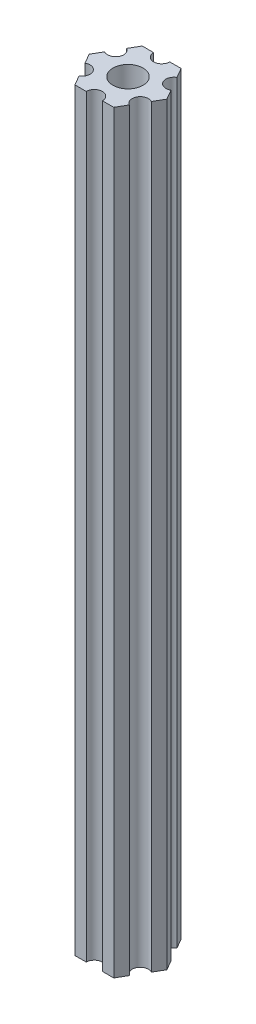
ISO-10303-21;
HEADER;
FILE_DESCRIPTION(('STEP AP214'),'2;1');
FILE_NAME('part.step','',(''),(''),'','','');
FILE_SCHEMA(('AUTOMOTIVE_DESIGN { 1 0 10303 214 1 1 1 1 }'));
ENDSEC;
DATA;
#1=APPLICATION_CONTEXT('core data for automotive mechanical design processes');
#2=APPLICATION_PROTOCOL_DEFINITION('international standard','automotive_design',2000,#1);
#3=PRODUCT_CONTEXT('',#1,'mechanical');
#4=PRODUCT('Part','Part','',(#3));
#5=PRODUCT_RELATED_PRODUCT_CATEGORY('part','',(#4));
#6=PRODUCT_DEFINITION_FORMATION('','',#4);
#7=PRODUCT_DEFINITION_CONTEXT('part definition',#1,'design');
#8=PRODUCT_DEFINITION('design','',#6,#7);
#9=PRODUCT_DEFINITION_SHAPE('','',#8);
#10=(LENGTH_UNIT() NAMED_UNIT(*) SI_UNIT(.MILLI.,.METRE.));
#11=(NAMED_UNIT(*) PLANE_ANGLE_UNIT() SI_UNIT($,.RADIAN.));
#12=(NAMED_UNIT(*) SI_UNIT($,.STERADIAN.) SOLID_ANGLE_UNIT());
#13=UNCERTAINTY_MEASURE_WITH_UNIT(LENGTH_MEASURE(1.E-05),#10,'distance_accuracy_value','');
#14=(GEOMETRIC_REPRESENTATION_CONTEXT(3) GLOBAL_UNCERTAINTY_ASSIGNED_CONTEXT((#13)) GLOBAL_UNIT_ASSIGNED_CONTEXT((#10,
#11,#12)) REPRESENTATION_CONTEXT('',''));
#15=CARTESIAN_POINT('',(0.,0.,0.));
#16=DIRECTION('',(0.,0.,1.));
#17=DIRECTION('',(1.,0.,0.));
#18=AXIS2_PLACEMENT_3D('',#15,#16,#17);
#19=CARTESIAN_POINT('',(5.41265877365274,-55.,3.125));
#20=DIRECTION('',(0.,1.,0.));
#21=DIRECTION('',(0.,0.,1.));
#22=AXIS2_PLACEMENT_3D('',#19,#20,#21);
#23=CYLINDRICAL_SURFACE('',#22,1.5);
#24=CARTESIAN_POINT('',(5.41265877365274,85.,3.125));
#25=DIRECTION('',(0.,-1.,0.));
#26=DIRECTION('',(0.,0.,-1.));
#27=AXIS2_PLACEMENT_3D('',#24,#25,#26);
#28=CIRCLE('',#27,1.5);
#29=CARTESIAN_POINT('',(4.66265877365274,85.,4.42403810567666));
#30=VERTEX_POINT('',#29);
#31=CARTESIAN_POINT('',(6.16265877365274,85.,1.82596189432335));
#32=VERTEX_POINT('',#31);
#33=EDGE_CURVE('E190',#30,#32,#28,.T.);
#34=ORIENTED_EDGE('',*,*,#33,.F.);
#35=DIRECTION('',(0.,1.,0.));
#36=VECTOR('',#35,1.);
#37=CARTESIAN_POINT('',(4.66265877365274,-55.,4.42403810567666));
#38=LINE('',#37,#36);
#39=CARTESIAN_POINT('',(4.66265877365274,-55.,4.42403810567666));
#40=VERTEX_POINT('',#39);
#41=EDGE_CURVE('E11',#40,#30,#38,.T.);
#42=ORIENTED_EDGE('',*,*,#41,.F.);
#43=CARTESIAN_POINT('',(5.41265877365274,-55.,3.125));
#44=DIRECTION('',(0.,-1.,0.));
#45=DIRECTION('',(0.,0.,-1.));
#46=AXIS2_PLACEMENT_3D('',#43,#44,#45);
#47=CIRCLE('',#46,1.5);
#48=CARTESIAN_POINT('',(6.16265877365274,-55.,1.82596189432335));
#49=VERTEX_POINT('',#48);
#50=EDGE_CURVE('E241',#40,#49,#47,.T.);
#51=ORIENTED_EDGE('',*,*,#50,.T.);
#52=DIRECTION('',(0.,1.,0.));
#53=VECTOR('',#52,1.);
#54=CARTESIAN_POINT('',(6.16265877365274,-55.,1.82596189432335));
#55=LINE('',#54,#53);
#56=EDGE_CURVE('E36',#49,#32,#55,.T.);
#57=ORIENTED_EDGE('',*,*,#56,.T.);
#58=EDGE_LOOP('',(#34,#42,#51,#57));
#59=FACE_BOUND('',#58,.T.);
#60=ADVANCED_FACE('F33',(#59),#23,.F.);
#61=CARTESIAN_POINT('',(3.60843918243516,-55.,6.25));
#62=DIRECTION('',(0.866025403784439,0.,0.5));
#63=DIRECTION('',(0.5,0.,-0.866025403784439));
#64=AXIS2_PLACEMENT_3D('',#61,#62,#63);
#65=PLANE('',#64);
#66=DIRECTION('',(0.5,0.,-0.866025403784439));
#67=VECTOR('',#66,1.);
#68=CARTESIAN_POINT('',(3.60843918243516,85.,6.25));
#69=LINE('',#68,#67);
#70=CARTESIAN_POINT('',(3.60843918243516,85.,6.25));
#71=VERTEX_POINT('',#70);
#72=EDGE_CURVE('E239',#71,#30,#69,.T.);
#73=ORIENTED_EDGE('',*,*,#72,.F.);
#74=DIRECTION('',(0.,1.,0.));
#75=VECTOR('',#74,1.);
#76=CARTESIAN_POINT('',(3.60843918243516,-55.,6.25));
#77=LINE('',#76,#75);
#78=CARTESIAN_POINT('',(3.60843918243516,-55.,6.25));
#79=VERTEX_POINT('',#78);
#80=EDGE_CURVE('E42',#79,#71,#77,.T.);
#81=ORIENTED_EDGE('',*,*,#80,.F.);
#82=DIRECTION('',(0.5,0.,-0.866025403784439));
#83=VECTOR('',#82,1.);
#84=CARTESIAN_POINT('',(3.60843918243516,-55.,6.25));
#85=LINE('',#84,#83);
#86=EDGE_CURVE('E180',#79,#40,#85,.T.);
#87=ORIENTED_EDGE('',*,*,#86,.T.);
#88=ORIENTED_EDGE('',*,*,#41,.T.);
#89=EDGE_LOOP('',(#73,#81,#87,#88));
#90=FACE_BOUND('',#89,.T.);
#91=ADVANCED_FACE('F273',(#90),#65,.T.);
#92=CARTESIAN_POINT('',(1.5,-55.,6.25));
#93=DIRECTION('',(0.,0.,1.));
#94=DIRECTION('',(1.,0.,0.));
#95=AXIS2_PLACEMENT_3D('',#92,#93,#94);
#96=PLANE('',#95);
#97=DIRECTION('',(1.,0.,0.));
#98=VECTOR('',#97,1.);
#99=CARTESIAN_POINT('',(1.5,85.,6.25));
#100=LINE('',#99,#98);
#101=CARTESIAN_POINT('',(1.5,85.,6.25));
#102=VERTEX_POINT('',#101);
#103=EDGE_CURVE('E167',#102,#71,#100,.T.);
#104=ORIENTED_EDGE('',*,*,#103,.F.);
#105=DIRECTION('',(0.,1.,0.));
#106=VECTOR('',#105,1.);
#107=CARTESIAN_POINT('',(1.5,-55.,6.25));
#108=LINE('',#107,#106);
#109=CARTESIAN_POINT('',(1.5,-55.,6.25));
#110=VERTEX_POINT('',#109);
#111=EDGE_CURVE('E162',#110,#102,#108,.T.);
#112=ORIENTED_EDGE('',*,*,#111,.F.);
#113=DIRECTION('',(1.,0.,0.));
#114=VECTOR('',#113,1.);
#115=CARTESIAN_POINT('',(1.5,-55.,6.25));
#116=LINE('',#115,#114);
#117=EDGE_CURVE('E165',#110,#79,#116,.T.);
#118=ORIENTED_EDGE('',*,*,#117,.T.);
#119=ORIENTED_EDGE('',*,*,#80,.T.);
#120=EDGE_LOOP('',(#104,#112,#118,#119));
#121=FACE_BOUND('',#120,.T.);
#122=ADVANCED_FACE('F164',(#121),#96,.T.);
#123=CARTESIAN_POINT('',(0.,-55.,6.25));
#124=DIRECTION('',(0.,1.,0.));
#125=DIRECTION('',(0.,0.,1.));
#126=AXIS2_PLACEMENT_3D('',#123,#124,#125);
#127=CYLINDRICAL_SURFACE('',#126,1.5);
#128=CARTESIAN_POINT('',(0.,85.,6.25));
#129=DIRECTION('',(0.,-1.,0.));
#130=DIRECTION('',(0.,0.,-1.));
#131=AXIS2_PLACEMENT_3D('',#128,#129,#130);
#132=CIRCLE('',#131,1.5);
#133=CARTESIAN_POINT('',(-1.5,85.,6.25));
#134=VERTEX_POINT('',#133);
#135=EDGE_CURVE('E236',#134,#102,#132,.T.);
#136=ORIENTED_EDGE('',*,*,#135,.F.);
#137=DIRECTION('',(0.,1.,0.));
#138=VECTOR('',#137,1.);
#139=CARTESIAN_POINT('',(-1.5,-55.,6.25));
#140=LINE('',#139,#138);
#141=CARTESIAN_POINT('',(-1.5,-55.,6.25));
#142=VERTEX_POINT('',#141);
#143=EDGE_CURVE('E172',#142,#134,#140,.T.);
#144=ORIENTED_EDGE('',*,*,#143,.F.);
#145=CARTESIAN_POINT('',(0.,-55.,6.25));
#146=DIRECTION('',(0.,-1.,0.));
#147=DIRECTION('',(0.,0.,-1.));
#148=AXIS2_PLACEMENT_3D('',#145,#146,#147);
#149=CIRCLE('',#148,1.5);
#150=EDGE_CURVE('E178',#142,#110,#149,.T.);
#151=ORIENTED_EDGE('',*,*,#150,.T.);
#152=ORIENTED_EDGE('',*,*,#111,.T.);
#153=EDGE_LOOP('',(#136,#144,#151,#152));
#154=FACE_BOUND('',#153,.T.);
#155=ADVANCED_FACE('F182',(#154),#127,.F.);
#156=CARTESIAN_POINT('',(-3.60843918243516,-55.,6.25));
#157=DIRECTION('',(0.,0.,1.));
#158=DIRECTION('',(1.,0.,0.));
#159=AXIS2_PLACEMENT_3D('',#156,#157,#158);
#160=PLANE('',#159);
#161=DIRECTION('',(1.,0.,0.));
#162=VECTOR('',#161,1.);
#163=CARTESIAN_POINT('',(-3.60843918243516,85.,6.25));
#164=LINE('',#163,#162);
#165=CARTESIAN_POINT('',(-3.60843918243516,85.,6.25));
#166=VERTEX_POINT('',#165);
#167=EDGE_CURVE('E233',#166,#134,#164,.T.);
#168=ORIENTED_EDGE('',*,*,#167,.F.);
#169=DIRECTION('',(0.,1.,0.));
#170=VECTOR('',#169,1.);
#171=CARTESIAN_POINT('',(-3.60843918243516,-55.,6.25));
#172=LINE('',#171,#170);
#173=CARTESIAN_POINT('',(-3.60843918243516,-55.,6.25));
#174=VERTEX_POINT('',#173);
#175=EDGE_CURVE('E245',#174,#166,#172,.T.);
#176=ORIENTED_EDGE('',*,*,#175,.F.);
#177=DIRECTION('',(1.,0.,0.));
#178=VECTOR('',#177,1.);
#179=CARTESIAN_POINT('',(-3.60843918243516,-55.,6.25));
#180=LINE('',#179,#178);
#181=EDGE_CURVE('E183',#174,#142,#180,.T.);
#182=ORIENTED_EDGE('',*,*,#181,.T.);
#183=ORIENTED_EDGE('',*,*,#143,.T.);
#184=EDGE_LOOP('',(#168,#176,#182,#183));
#185=FACE_BOUND('',#184,.T.);
#186=ADVANCED_FACE('F286',(#185),#160,.T.);
#187=CARTESIAN_POINT('',(-4.66265877365274,-55.,4.42403810567666));
#188=DIRECTION('',(-0.866025403784439,0.,0.5));
#189=DIRECTION('',(0.5,0.,0.866025403784439));
#190=AXIS2_PLACEMENT_3D('',#187,#188,#189);
#191=PLANE('',#190);
#192=DIRECTION('',(0.5,0.,0.866025403784439));
#193=VECTOR('',#192,1.);
#194=CARTESIAN_POINT('',(-4.66265877365274,85.,4.42403810567666));
#195=LINE('',#194,#193);
#196=CARTESIAN_POINT('',(-4.66265877365274,85.,4.42403810567666));
#197=VERTEX_POINT('',#196);
#198=EDGE_CURVE('E230',#197,#166,#195,.T.);
#199=ORIENTED_EDGE('',*,*,#198,.F.);
#200=DIRECTION('',(0.,1.,0.));
#201=VECTOR('',#200,1.);
#202=CARTESIAN_POINT('',(-4.66265877365274,-55.,4.42403810567666));
#203=LINE('',#202,#201);
#204=CARTESIAN_POINT('',(-4.66265877365274,-55.,4.42403810567666));
#205=VERTEX_POINT('',#204);
#206=EDGE_CURVE('E247',#205,#197,#203,.T.);
#207=ORIENTED_EDGE('',*,*,#206,.F.);
#208=DIRECTION('',(0.5,0.,0.866025403784439));
#209=VECTOR('',#208,1.);
#210=CARTESIAN_POINT('',(-4.66265877365274,-55.,4.42403810567666));
#211=LINE('',#210,#209);
#212=EDGE_CURVE('E185',#205,#174,#211,.T.);
#213=ORIENTED_EDGE('',*,*,#212,.T.);
#214=ORIENTED_EDGE('',*,*,#175,.T.);
#215=EDGE_LOOP('',(#199,#207,#213,#214));
#216=FACE_BOUND('',#215,.T.);
#217=ADVANCED_FACE('F289',(#216),#191,.T.);
#218=CARTESIAN_POINT('',(-5.41265877365274,-55.,3.125));
#219=DIRECTION('',(0.,1.,0.));
#220=DIRECTION('',(0.,0.,1.));
#221=AXIS2_PLACEMENT_3D('',#218,#219,#220);
#222=CYLINDRICAL_SURFACE('',#221,1.5);
#223=CARTESIAN_POINT('',(-5.41265877365274,85.,3.125));
#224=DIRECTION('',(0.,-1.,0.));
#225=DIRECTION('',(0.,0.,-1.));
#226=AXIS2_PLACEMENT_3D('',#223,#224,#225);
#227=CIRCLE('',#226,1.5);
#228=CARTESIAN_POINT('',(-6.16265877365274,85.,1.82596189432335));
#229=VERTEX_POINT('',#228);
#230=EDGE_CURVE('E227',#229,#197,#227,.T.);
#231=ORIENTED_EDGE('',*,*,#230,.F.);
#232=DIRECTION('',(0.,1.,0.));
#233=VECTOR('',#232,1.);
#234=CARTESIAN_POINT('',(-6.16265877365274,-55.,1.82596189432335));
#235=LINE('',#234,#233);
#236=CARTESIAN_POINT('',(-6.16265877365274,-55.,1.82596189432335));
#237=VERTEX_POINT('',#236);
#238=EDGE_CURVE('E249',#237,#229,#235,.T.);
#239=ORIENTED_EDGE('',*,*,#238,.F.);
#240=CARTESIAN_POINT('',(-5.41265877365274,-55.,3.125));
#241=DIRECTION('',(0.,-1.,0.));
#242=DIRECTION('',(0.,0.,-1.));
#243=AXIS2_PLACEMENT_3D('',#240,#241,#242);
#244=CIRCLE('',#243,1.5);
#245=EDGE_CURVE('E394',#237,#205,#244,.T.);
#246=ORIENTED_EDGE('',*,*,#245,.T.);
#247=ORIENTED_EDGE('',*,*,#206,.T.);
#248=EDGE_LOOP('',(#231,#239,#246,#247));
#249=FACE_BOUND('',#248,.T.);
#250=ADVANCED_FACE('F293',(#249),#222,.F.);
#251=CARTESIAN_POINT('',(-7.21687836487032,-55.,0.));
#252=DIRECTION('',(-0.86602540378444,0.,0.499999999999998));
#253=DIRECTION('',(0.499999999999998,0.,0.86602540378444));
#254=AXIS2_PLACEMENT_3D('',#251,#252,#253);
#255=PLANE('',#254);
#256=DIRECTION('',(0.499999999999998,0.,0.86602540378444));
#257=VECTOR('',#256,1.);
#258=CARTESIAN_POINT('',(-7.21687836487032,85.,0.));
#259=LINE('',#258,#257);
#260=CARTESIAN_POINT('',(-7.21687836487032,85.,0.));
#261=VERTEX_POINT('',#260);
#262=EDGE_CURVE('E224',#261,#229,#259,.T.);
#263=ORIENTED_EDGE('',*,*,#262,.F.);
#264=DIRECTION('',(0.,1.,0.));
#265=VECTOR('',#264,1.);
#266=CARTESIAN_POINT('',(-7.21687836487032,-55.,0.));
#267=LINE('',#266,#265);
#268=CARTESIAN_POINT('',(-7.21687836487032,-55.,0.));
#269=VERTEX_POINT('',#268);
#270=EDGE_CURVE('E251',#269,#261,#267,.T.);
#271=ORIENTED_EDGE('',*,*,#270,.F.);
#272=DIRECTION('',(0.499999999999998,0.,0.86602540378444));
#273=VECTOR('',#272,1.);
#274=CARTESIAN_POINT('',(-7.21687836487032,-55.,0.));
#275=LINE('',#274,#273);
#276=EDGE_CURVE('E391',#269,#237,#275,.T.);
#277=ORIENTED_EDGE('',*,*,#276,.T.);
#278=ORIENTED_EDGE('',*,*,#238,.T.);
#279=EDGE_LOOP('',(#263,#271,#277,#278));
#280=FACE_BOUND('',#279,.T.);
#281=ADVANCED_FACE('F297',(#280),#255,.T.);
#282=CARTESIAN_POINT('',(-6.16265877365274,-55.,-1.82596189432334));
#283=DIRECTION('',(-0.866025403784438,0.,-0.5));
#284=DIRECTION('',(-0.5,0.,0.866025403784438));
#285=AXIS2_PLACEMENT_3D('',#282,#283,#284);
#286=PLANE('',#285);
#287=DIRECTION('',(-0.5,0.,0.866025403784438));
#288=VECTOR('',#287,1.);
#289=CARTESIAN_POINT('',(-6.16265877365274,85.,-1.82596189432334));
#290=LINE('',#289,#288);
#291=CARTESIAN_POINT('',(-6.16265877365274,85.,-1.82596189432334));
#292=VERTEX_POINT('',#291);
#293=EDGE_CURVE('E221',#292,#261,#290,.T.);
#294=ORIENTED_EDGE('',*,*,#293,.F.);
#295=DIRECTION('',(0.,1.,0.));
#296=VECTOR('',#295,1.);
#297=CARTESIAN_POINT('',(-6.16265877365274,-55.,-1.82596189432334));
#298=LINE('',#297,#296);
#299=CARTESIAN_POINT('',(-6.16265877365274,-55.,-1.82596189432334));
#300=VERTEX_POINT('',#299);
#301=EDGE_CURVE('E253',#300,#292,#298,.T.);
#302=ORIENTED_EDGE('',*,*,#301,.F.);
#303=DIRECTION('',(-0.5,0.,0.866025403784438));
#304=VECTOR('',#303,1.);
#305=CARTESIAN_POINT('',(-6.16265877365274,-55.,-1.82596189432334));
#306=LINE('',#305,#304);
#307=EDGE_CURVE('E388',#300,#269,#306,.T.);
#308=ORIENTED_EDGE('',*,*,#307,.T.);
#309=ORIENTED_EDGE('',*,*,#270,.T.);
#310=EDGE_LOOP('',(#294,#302,#308,#309));
#311=FACE_BOUND('',#310,.T.);
#312=ADVANCED_FACE('F301',(#311),#286,.T.);
#313=CARTESIAN_POINT('',(-5.41265877365274,-55.,-3.125));
#314=DIRECTION('',(0.,1.,0.));
#315=DIRECTION('',(0.,0.,1.));
#316=AXIS2_PLACEMENT_3D('',#313,#314,#315);
#317=CYLINDRICAL_SURFACE('',#316,1.5);
#318=CARTESIAN_POINT('',(-5.41265877365274,85.,-3.125));
#319=DIRECTION('',(0.,-1.,0.));
#320=DIRECTION('',(0.,0.,-1.));
#321=AXIS2_PLACEMENT_3D('',#318,#319,#320);
#322=CIRCLE('',#321,1.5);
#323=CARTESIAN_POINT('',(-4.66265877365274,85.,-4.42403810567666));
#324=VERTEX_POINT('',#323);
#325=EDGE_CURVE('E218',#324,#292,#322,.T.);
#326=ORIENTED_EDGE('',*,*,#325,.F.);
#327=DIRECTION('',(0.,1.,0.));
#328=VECTOR('',#327,1.);
#329=CARTESIAN_POINT('',(-4.66265877365274,-55.,-4.42403810567666));
#330=LINE('',#329,#328);
#331=CARTESIAN_POINT('',(-4.66265877365274,-55.,-4.42403810567666));
#332=VERTEX_POINT('',#331);
#333=EDGE_CURVE('E255',#332,#324,#330,.T.);
#334=ORIENTED_EDGE('',*,*,#333,.F.);
#335=CARTESIAN_POINT('',(-5.41265877365274,-55.,-3.125));
#336=DIRECTION('',(0.,-1.,0.));
#337=DIRECTION('',(0.,0.,-1.));
#338=AXIS2_PLACEMENT_3D('',#335,#336,#337);
#339=CIRCLE('',#338,1.5);
#340=EDGE_CURVE('E385',#332,#300,#339,.T.);
#341=ORIENTED_EDGE('',*,*,#340,.T.);
#342=ORIENTED_EDGE('',*,*,#301,.T.);
#343=EDGE_LOOP('',(#326,#334,#341,#342));
#344=FACE_BOUND('',#343,.T.);
#345=ADVANCED_FACE('F305',(#344),#317,.F.);
#346=CARTESIAN_POINT('',(-3.60843918243516,-55.,-6.25));
#347=DIRECTION('',(-0.866025403784439,0.,-0.5));
#348=DIRECTION('',(-0.5,0.,0.866025403784439));
#349=AXIS2_PLACEMENT_3D('',#346,#347,#348);
#350=PLANE('',#349);
#351=DIRECTION('',(-0.5,0.,0.866025403784439));
#352=VECTOR('',#351,1.);
#353=CARTESIAN_POINT('',(-3.60843918243516,85.,-6.25));
#354=LINE('',#353,#352);
#355=CARTESIAN_POINT('',(-3.60843918243516,85.,-6.25));
#356=VERTEX_POINT('',#355);
#357=EDGE_CURVE('E215',#356,#324,#354,.T.);
#358=ORIENTED_EDGE('',*,*,#357,.F.);
#359=DIRECTION('',(0.,1.,0.));
#360=VECTOR('',#359,1.);
#361=CARTESIAN_POINT('',(-3.60843918243516,-55.,-6.25));
#362=LINE('',#361,#360);
#363=CARTESIAN_POINT('',(-3.60843918243516,-55.,-6.25));
#364=VERTEX_POINT('',#363);
#365=EDGE_CURVE('E257',#364,#356,#362,.T.);
#366=ORIENTED_EDGE('',*,*,#365,.F.);
#367=DIRECTION('',(-0.5,0.,0.866025403784439));
#368=VECTOR('',#367,1.);
#369=CARTESIAN_POINT('',(-3.60843918243516,-55.,-6.25));
#370=LINE('',#369,#368);
#371=EDGE_CURVE('E382',#364,#332,#370,.T.);
#372=ORIENTED_EDGE('',*,*,#371,.T.);
#373=ORIENTED_EDGE('',*,*,#333,.T.);
#374=EDGE_LOOP('',(#358,#366,#372,#373));
#375=FACE_BOUND('',#374,.T.);
#376=ADVANCED_FACE('F309',(#375),#350,.T.);
#377=CARTESIAN_POINT('',(-1.5,-55.,-6.25));
#378=DIRECTION('',(0.,0.,-1.));
#379=DIRECTION('',(-1.,0.,0.));
#380=AXIS2_PLACEMENT_3D('',#377,#378,#379);
#381=PLANE('',#380);
#382=DIRECTION('',(-1.,0.,0.));
#383=VECTOR('',#382,1.);
#384=CARTESIAN_POINT('',(-1.5,85.,-6.25));
#385=LINE('',#384,#383);
#386=CARTESIAN_POINT('',(-1.5,85.,-6.25));
#387=VERTEX_POINT('',#386);
#388=EDGE_CURVE('E212',#387,#356,#385,.T.);
#389=ORIENTED_EDGE('',*,*,#388,.F.);
#390=DIRECTION('',(0.,1.,0.));
#391=VECTOR('',#390,1.);
#392=CARTESIAN_POINT('',(-1.5,-55.,-6.25));
#393=LINE('',#392,#391);
#394=CARTESIAN_POINT('',(-1.5,-55.,-6.25));
#395=VERTEX_POINT('',#394);
#396=EDGE_CURVE('E259',#395,#387,#393,.T.);
#397=ORIENTED_EDGE('',*,*,#396,.F.);
#398=DIRECTION('',(-1.,0.,0.));
#399=VECTOR('',#398,1.);
#400=CARTESIAN_POINT('',(-1.5,-55.,-6.25));
#401=LINE('',#400,#399);
#402=EDGE_CURVE('E379',#395,#364,#401,.T.);
#403=ORIENTED_EDGE('',*,*,#402,.T.);
#404=ORIENTED_EDGE('',*,*,#365,.T.);
#405=EDGE_LOOP('',(#389,#397,#403,#404));
#406=FACE_BOUND('',#405,.T.);
#407=ADVANCED_FACE('F313',(#406),#381,.T.);
#408=CARTESIAN_POINT('',(0.,-55.,-6.25));
#409=DIRECTION('',(0.,1.,0.));
#410=DIRECTION('',(0.,0.,1.));
#411=AXIS2_PLACEMENT_3D('',#408,#409,#410);
#412=CYLINDRICAL_SURFACE('',#411,1.5);
#413=CARTESIAN_POINT('',(0.,85.,-6.25));
#414=DIRECTION('',(0.,-1.,0.));
#415=DIRECTION('',(0.,0.,-1.));
#416=AXIS2_PLACEMENT_3D('',#413,#414,#415);
#417=CIRCLE('',#416,1.5);
#418=CARTESIAN_POINT('',(1.5,85.,-6.25));
#419=VERTEX_POINT('',#418);
#420=EDGE_CURVE('E209',#419,#387,#417,.T.);
#421=ORIENTED_EDGE('',*,*,#420,.F.);
#422=DIRECTION('',(0.,1.,0.));
#423=VECTOR('',#422,1.);
#424=CARTESIAN_POINT('',(1.5,-55.,-6.25));
#425=LINE('',#424,#423);
#426=CARTESIAN_POINT('',(1.5,-55.,-6.25));
#427=VERTEX_POINT('',#426);
#428=EDGE_CURVE('E261',#427,#419,#425,.T.);
#429=ORIENTED_EDGE('',*,*,#428,.F.);
#430=CARTESIAN_POINT('',(0.,-55.,-6.25));
#431=DIRECTION('',(0.,-1.,0.));
#432=DIRECTION('',(0.,0.,-1.));
#433=AXIS2_PLACEMENT_3D('',#430,#431,#432);
#434=CIRCLE('',#433,1.5);
#435=EDGE_CURVE('E376',#427,#395,#434,.T.);
#436=ORIENTED_EDGE('',*,*,#435,.T.);
#437=ORIENTED_EDGE('',*,*,#396,.T.);
#438=EDGE_LOOP('',(#421,#429,#436,#437));
#439=FACE_BOUND('',#438,.T.);
#440=ADVANCED_FACE('F317',(#439),#412,.F.);
#441=CARTESIAN_POINT('',(3.60843918243516,-55.,-6.25));
#442=DIRECTION('',(0.,0.,-1.));
#443=DIRECTION('',(-1.,0.,0.));
#444=AXIS2_PLACEMENT_3D('',#441,#442,#443);
#445=PLANE('',#444);
#446=DIRECTION('',(-1.,0.,0.));
#447=VECTOR('',#446,1.);
#448=CARTESIAN_POINT('',(3.60843918243516,85.,-6.25));
#449=LINE('',#448,#447);
#450=CARTESIAN_POINT('',(3.60843918243516,85.,-6.25));
#451=VERTEX_POINT('',#450);
#452=EDGE_CURVE('E206',#451,#419,#449,.T.);
#453=ORIENTED_EDGE('',*,*,#452,.F.);
#454=DIRECTION('',(0.,1.,0.));
#455=VECTOR('',#454,1.);
#456=CARTESIAN_POINT('',(3.60843918243516,-55.,-6.25));
#457=LINE('',#456,#455);
#458=CARTESIAN_POINT('',(3.60843918243516,-55.,-6.25));
#459=VERTEX_POINT('',#458);
#460=EDGE_CURVE('E263',#459,#451,#457,.T.);
#461=ORIENTED_EDGE('',*,*,#460,.F.);
#462=DIRECTION('',(-1.,0.,0.));
#463=VECTOR('',#462,1.);
#464=CARTESIAN_POINT('',(3.60843918243516,-55.,-6.25));
#465=LINE('',#464,#463);
#466=EDGE_CURVE('E373',#459,#427,#465,.T.);
#467=ORIENTED_EDGE('',*,*,#466,.T.);
#468=ORIENTED_EDGE('',*,*,#428,.T.);
#469=EDGE_LOOP('',(#453,#461,#467,#468));
#470=FACE_BOUND('',#469,.T.);
#471=ADVANCED_FACE('F321',(#470),#445,.T.);
#472=CARTESIAN_POINT('',(4.66265877365274,-55.,-4.42403810567666));
#473=DIRECTION('',(0.866025403784439,0.,-0.5));
#474=DIRECTION('',(-0.5,0.,-0.866025403784439));
#475=AXIS2_PLACEMENT_3D('',#472,#473,#474);
#476=PLANE('',#475);
#477=DIRECTION('',(-0.5,0.,-0.866025403784439));
#478=VECTOR('',#477,1.);
#479=CARTESIAN_POINT('',(4.66265877365274,85.,-4.42403810567666));
#480=LINE('',#479,#478);
#481=CARTESIAN_POINT('',(4.66265877365274,85.,-4.42403810567666));
#482=VERTEX_POINT('',#481);
#483=EDGE_CURVE('E203',#482,#451,#480,.T.);
#484=ORIENTED_EDGE('',*,*,#483,.F.);
#485=DIRECTION('',(0.,1.,0.));
#486=VECTOR('',#485,1.);
#487=CARTESIAN_POINT('',(4.66265877365274,-55.,-4.42403810567666));
#488=LINE('',#487,#486);
#489=CARTESIAN_POINT('',(4.66265877365274,-55.,-4.42403810567666));
#490=VERTEX_POINT('',#489);
#491=EDGE_CURVE('E265',#490,#482,#488,.T.);
#492=ORIENTED_EDGE('',*,*,#491,.F.);
#493=DIRECTION('',(-0.5,0.,-0.866025403784439));
#494=VECTOR('',#493,1.);
#495=CARTESIAN_POINT('',(4.66265877365274,-55.,-4.42403810567666));
#496=LINE('',#495,#494);
#497=EDGE_CURVE('E370',#490,#459,#496,.T.);
#498=ORIENTED_EDGE('',*,*,#497,.T.);
#499=ORIENTED_EDGE('',*,*,#460,.T.);
#500=EDGE_LOOP('',(#484,#492,#498,#499));
#501=FACE_BOUND('',#500,.T.);
#502=ADVANCED_FACE('F325',(#501),#476,.T.);
#503=CARTESIAN_POINT('',(5.41265877365274,-55.,-3.125));
#504=DIRECTION('',(0.,1.,0.));
#505=DIRECTION('',(0.,0.,1.));
#506=AXIS2_PLACEMENT_3D('',#503,#504,#505);
#507=CYLINDRICAL_SURFACE('',#506,1.5);
#508=CARTESIAN_POINT('',(5.41265877365274,85.,-3.125));
#509=DIRECTION('',(0.,-1.,0.));
#510=DIRECTION('',(0.,0.,-1.));
#511=AXIS2_PLACEMENT_3D('',#508,#509,#510);
#512=CIRCLE('',#511,1.5);
#513=CARTESIAN_POINT('',(6.16265877365274,85.,-1.82596189432334));
#514=VERTEX_POINT('',#513);
#515=EDGE_CURVE('E200',#514,#482,#512,.T.);
#516=ORIENTED_EDGE('',*,*,#515,.F.);
#517=DIRECTION('',(0.,1.,0.));
#518=VECTOR('',#517,1.);
#519=CARTESIAN_POINT('',(6.16265877365274,-55.,-1.82596189432334));
#520=LINE('',#519,#518);
#521=CARTESIAN_POINT('',(6.16265877365274,-55.,-1.82596189432334));
#522=VERTEX_POINT('',#521);
#523=EDGE_CURVE('E267',#522,#514,#520,.T.);
#524=ORIENTED_EDGE('',*,*,#523,.F.);
#525=CARTESIAN_POINT('',(5.41265877365274,-55.,-3.125));
#526=DIRECTION('',(0.,-1.,0.));
#527=DIRECTION('',(0.,0.,-1.));
#528=AXIS2_PLACEMENT_3D('',#525,#526,#527);
#529=CIRCLE('',#528,1.5);
#530=EDGE_CURVE('E367',#522,#490,#529,.T.);
#531=ORIENTED_EDGE('',*,*,#530,.T.);
#532=ORIENTED_EDGE('',*,*,#491,.T.);
#533=EDGE_LOOP('',(#516,#524,#531,#532));
#534=FACE_BOUND('',#533,.T.);
#535=ADVANCED_FACE('F329',(#534),#507,.F.);
#536=CARTESIAN_POINT('',(7.21687836487032,-55.,0.));
#537=DIRECTION('',(0.866025403784439,0.,-0.5));
#538=DIRECTION('',(-0.5,0.,-0.866025403784439));
#539=AXIS2_PLACEMENT_3D('',#536,#537,#538);
#540=PLANE('',#539);
#541=DIRECTION('',(-0.5,0.,-0.866025403784439));
#542=VECTOR('',#541,1.);
#543=CARTESIAN_POINT('',(7.21687836487032,85.,0.));
#544=LINE('',#543,#542);
#545=CARTESIAN_POINT('',(7.21687836487032,85.,0.));
#546=VERTEX_POINT('',#545);
#547=EDGE_CURVE('E197',#546,#514,#544,.T.);
#548=ORIENTED_EDGE('',*,*,#547,.F.);
#549=DIRECTION('',(0.,1.,0.));
#550=VECTOR('',#549,1.);
#551=CARTESIAN_POINT('',(7.21687836487032,-55.,0.));
#552=LINE('',#551,#550);
#553=CARTESIAN_POINT('',(7.21687836487032,-55.,0.));
#554=VERTEX_POINT('',#553);
#555=EDGE_CURVE('E268',#554,#546,#552,.T.);
#556=ORIENTED_EDGE('',*,*,#555,.F.);
#557=DIRECTION('',(-0.5,0.,-0.866025403784439));
#558=VECTOR('',#557,1.);
#559=CARTESIAN_POINT('',(7.21687836487032,-55.,0.));
#560=LINE('',#559,#558);
#561=EDGE_CURVE('E364',#554,#522,#560,.T.);
#562=ORIENTED_EDGE('',*,*,#561,.T.);
#563=ORIENTED_EDGE('',*,*,#523,.T.);
#564=EDGE_LOOP('',(#548,#556,#562,#563));
#565=FACE_BOUND('',#564,.T.);
#566=ADVANCED_FACE('F333',(#565),#540,.T.);
#567=CARTESIAN_POINT('',(6.16265877365274,-55.,1.82596189432335));
#568=DIRECTION('',(0.86602540378444,0.,0.499999999999999));
#569=DIRECTION('',(0.499999999999999,0.,-0.86602540378444));
#570=AXIS2_PLACEMENT_3D('',#567,#568,#569);
#571=PLANE('',#570);
#572=DIRECTION('',(0.499999999999999,0.,-0.86602540378444));
#573=VECTOR('',#572,1.);
#574=CARTESIAN_POINT('',(6.16265877365274,85.,1.82596189432335));
#575=LINE('',#574,#573);
#576=EDGE_CURVE('E193',#32,#546,#575,.T.);
#577=ORIENTED_EDGE('',*,*,#576,.F.);
#578=ORIENTED_EDGE('',*,*,#56,.F.);
#579=DIRECTION('',(0.499999999999999,0.,-0.86602540378444));
#580=VECTOR('',#579,1.);
#581=CARTESIAN_POINT('',(6.16265877365274,-55.,1.82596189432335));
#582=LINE('',#581,#580);
#583=EDGE_CURVE('E362',#49,#554,#582,.T.);
#584=ORIENTED_EDGE('',*,*,#583,.T.);
#585=ORIENTED_EDGE('',*,*,#555,.T.);
#586=EDGE_LOOP('',(#577,#578,#584,#585));
#587=FACE_BOUND('',#586,.T.);
#588=ADVANCED_FACE('F270',(#587),#571,.T.);
#589=CARTESIAN_POINT('',(5.41265877365274,-55.,3.125));
#590=DIRECTION('',(0.,-1.,0.));
#591=DIRECTION('',(0.,0.,-1.));
#592=AXIS2_PLACEMENT_3D('',#589,#590,#591);
#593=PLANE('',#592);
#594=CARTESIAN_POINT('',(0.,-55.,0.));
#595=DIRECTION('',(0.,1.,0.));
#596=DIRECTION('',(0.,0.,-1.));
#597=AXIS2_PLACEMENT_3D('',#594,#595,#596);
#598=CIRCLE('',#597,2.79);
#599=CARTESIAN_POINT('',(0.,-55.,-2.79));
#600=VERTEX_POINT('',#599);
#601=EDGE_CURVE('E194',#600,#600,#598,.T.);
#602=ORIENTED_EDGE('',*,*,#601,.T.);
#603=EDGE_LOOP('',(#602));
#604=FACE_BOUND('',#603,.T.);
#605=ORIENTED_EDGE('',*,*,#50,.F.);
#606=ORIENTED_EDGE('',*,*,#86,.F.);
#607=ORIENTED_EDGE('',*,*,#117,.F.);
#608=ORIENTED_EDGE('',*,*,#150,.F.);
#609=ORIENTED_EDGE('',*,*,#181,.F.);
#610=ORIENTED_EDGE('',*,*,#212,.F.);
#611=ORIENTED_EDGE('',*,*,#245,.F.);
#612=ORIENTED_EDGE('',*,*,#276,.F.);
#613=ORIENTED_EDGE('',*,*,#307,.F.);
#614=ORIENTED_EDGE('',*,*,#340,.F.);
#615=ORIENTED_EDGE('',*,*,#371,.F.);
#616=ORIENTED_EDGE('',*,*,#402,.F.);
#617=ORIENTED_EDGE('',*,*,#435,.F.);
#618=ORIENTED_EDGE('',*,*,#466,.F.);
#619=ORIENTED_EDGE('',*,*,#497,.F.);
#620=ORIENTED_EDGE('',*,*,#530,.F.);
#621=ORIENTED_EDGE('',*,*,#561,.F.);
#622=ORIENTED_EDGE('',*,*,#583,.F.);
#623=EDGE_LOOP('',(#605,#606,#607,#608,#609,#610,#611,#612,#613,#614,#615,#616,#617,#618,#619,
#620,#621,#622));
#624=FACE_BOUND('',#623,.T.);
#625=ADVANCED_FACE('F176',(#604,#624),#593,.T.);
#626=CARTESIAN_POINT('',(5.41265877365274,85.,3.125));
#627=DIRECTION('',(0.,-1.,0.));
#628=DIRECTION('',(0.,0.,-1.));
#629=AXIS2_PLACEMENT_3D('',#626,#627,#628);
#630=PLANE('',#629);
#631=CARTESIAN_POINT('',(0.,85.,0.));
#632=DIRECTION('',(0.,1.,0.));
#633=DIRECTION('',(0.,0.,-1.));
#634=AXIS2_PLACEMENT_3D('',#631,#632,#633);
#635=CIRCLE('',#634,2.79);
#636=CARTESIAN_POINT('',(0.,85.,-2.79));
#637=VERTEX_POINT('',#636);
#638=EDGE_CURVE('E357',#637,#637,#635,.T.);
#639=ORIENTED_EDGE('',*,*,#638,.F.);
#640=EDGE_LOOP('',(#639));
#641=FACE_BOUND('',#640,.T.);
#642=ORIENTED_EDGE('',*,*,#33,.T.);
#643=ORIENTED_EDGE('',*,*,#576,.T.);
#644=ORIENTED_EDGE('',*,*,#547,.T.);
#645=ORIENTED_EDGE('',*,*,#515,.T.);
#646=ORIENTED_EDGE('',*,*,#483,.T.);
#647=ORIENTED_EDGE('',*,*,#452,.T.);
#648=ORIENTED_EDGE('',*,*,#420,.T.);
#649=ORIENTED_EDGE('',*,*,#388,.T.);
#650=ORIENTED_EDGE('',*,*,#357,.T.);
#651=ORIENTED_EDGE('',*,*,#325,.T.);
#652=ORIENTED_EDGE('',*,*,#293,.T.);
#653=ORIENTED_EDGE('',*,*,#262,.T.);
#654=ORIENTED_EDGE('',*,*,#230,.T.);
#655=ORIENTED_EDGE('',*,*,#198,.T.);
#656=ORIENTED_EDGE('',*,*,#167,.T.);
#657=ORIENTED_EDGE('',*,*,#135,.T.);
#658=ORIENTED_EDGE('',*,*,#103,.T.);
#659=ORIENTED_EDGE('',*,*,#72,.T.);
#660=EDGE_LOOP('',(#642,#643,#644,#645,#646,#647,#648,#649,#650,#651,#652,#653,#654,#655,#656,
#657,#658,#659));
#661=FACE_BOUND('',#660,.T.);
#662=ADVANCED_FACE('F272',(#641,#661),#630,.F.);
#663=CARTESIAN_POINT('',(0.,-55.,0.));
#664=DIRECTION('',(0.,1.,0.));
#665=DIRECTION('',(0.,0.,1.));
#666=AXIS2_PLACEMENT_3D('',#663,#664,#665);
#667=CYLINDRICAL_SURFACE('',#666,2.79);
#668=ORIENTED_EDGE('',*,*,#601,.F.);
#669=EDGE_LOOP('',(#668));
#670=FACE_BOUND('',#669,.T.);
#671=ORIENTED_EDGE('',*,*,#638,.T.);
#672=EDGE_LOOP('',(#671));
#673=FACE_BOUND('',#672,.T.);
#674=ADVANCED_FACE('F345',(#670,#673),#667,.F.);
#675=CLOSED_SHELL('',(#60,#91,#122,#155,#186,#217,#250,#281,#312,#345,#376,#407,#440,#471,#502,
#535,#566,#588,#625,#662,#674));
#676=MANIFOLD_SOLID_BREP('B2',#675);
#677=ADVANCED_BREP_SHAPE_REPRESENTATION('',(#18,#676),#14);
#678=SHAPE_DEFINITION_REPRESENTATION(#9,#677);
ENDSEC;
END-ISO-10303-21;
